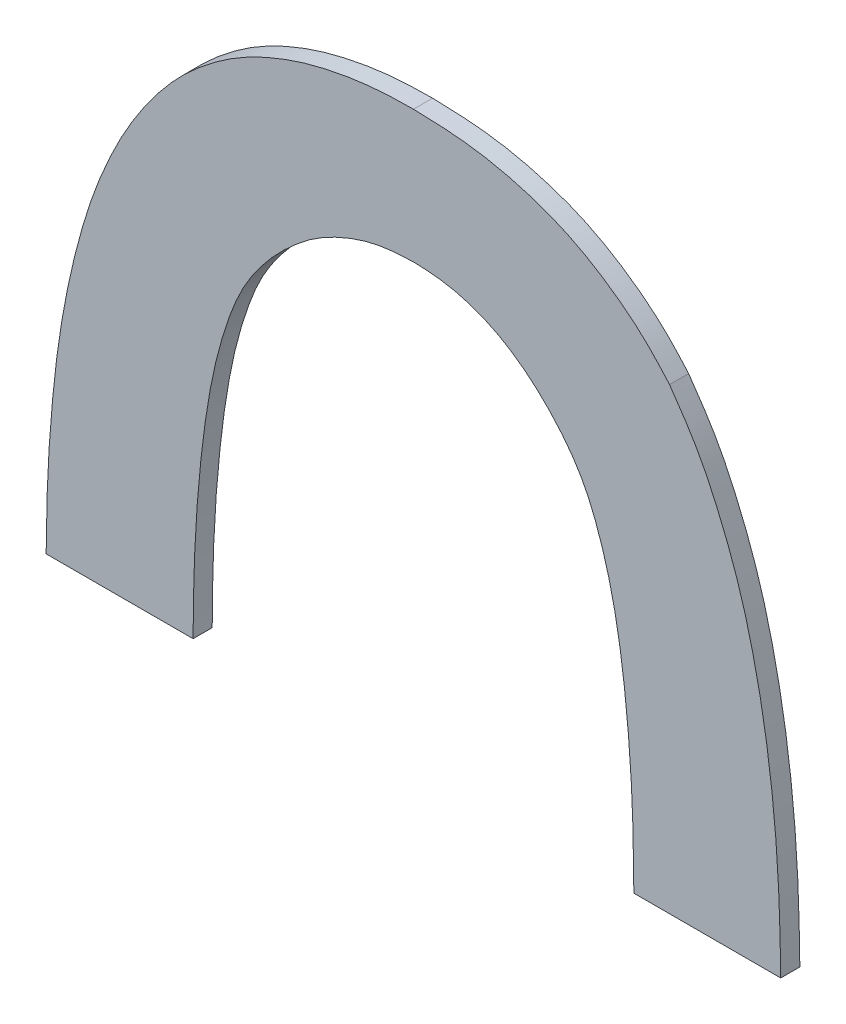
ISO-10303-21;
HEADER;
FILE_DESCRIPTION(('STEP AP214'),'2;1');
FILE_NAME('part.step','',(''),(''),'','','');
FILE_SCHEMA(('AUTOMOTIVE_DESIGN { 1 0 10303 214 1 1 1 1 }'));
ENDSEC;
DATA;
#1=APPLICATION_CONTEXT('core data for automotive mechanical design processes');
#2=APPLICATION_PROTOCOL_DEFINITION('international standard','automotive_design',2000,#1);
#3=PRODUCT_CONTEXT('',#1,'mechanical');
#4=PRODUCT('Part','Part','',(#3));
#5=PRODUCT_RELATED_PRODUCT_CATEGORY('part','',(#4));
#6=PRODUCT_DEFINITION_FORMATION('','',#4);
#7=PRODUCT_DEFINITION_CONTEXT('part definition',#1,'design');
#8=PRODUCT_DEFINITION('design','',#6,#7);
#9=PRODUCT_DEFINITION_SHAPE('','',#8);
#10=(LENGTH_UNIT() NAMED_UNIT(*) SI_UNIT(.MILLI.,.METRE.));
#11=(NAMED_UNIT(*) PLANE_ANGLE_UNIT() SI_UNIT($,.RADIAN.));
#12=(NAMED_UNIT(*) SI_UNIT($,.STERADIAN.) SOLID_ANGLE_UNIT());
#13=UNCERTAINTY_MEASURE_WITH_UNIT(LENGTH_MEASURE(1.E-05),#10,'distance_accuracy_value','');
#14=(GEOMETRIC_REPRESENTATION_CONTEXT(3) GLOBAL_UNCERTAINTY_ASSIGNED_CONTEXT((#13)) GLOBAL_UNIT_ASSIGNED_CONTEXT((#10,
#11,#12)) REPRESENTATION_CONTEXT('',''));
#15=CARTESIAN_POINT('',(0.,0.,0.));
#16=DIRECTION('',(0.,0.,1.));
#17=DIRECTION('',(1.,0.,0.));
#18=AXIS2_PLACEMENT_3D('',#15,#16,#17);
#19=CARTESIAN_POINT('',(9.0766529655937,6.58886102964351,0.5));
#20=DIRECTION('',(0.,0.,1.));
#21=DIRECTION('',(1.,0.,0.));
#22=AXIS2_PLACEMENT_3D('',#19,#20,#21);
#23=PLANE('',#22);
#24=CARTESIAN_POINT('',(6.70072115384615,12.4939903846154,0.5));
#25=CARTESIAN_POINT('',(6.93848015472102,12.1510195377811,0.5));
#26=CARTESIAN_POINT('',(7.42874939220466,11.4437989701565,0.5));
#27=CARTESIAN_POINT('',(8.0025670259053,10.2379222992365,0.5));
#28=CARTESIAN_POINT('',(8.51442251447216,8.91042139318135,0.5));
#29=CARTESIAN_POINT('',(8.91613522696191,7.4352508415858,0.5));
#30=CARTESIAN_POINT('',(9.23077641950199,5.82415133443517,0.5));
#31=CARTESIAN_POINT('',(9.45802591672864,4.07396155131179,0.5));
#32=CARTESIAN_POINT('',(9.58662675967264,2.18543763193961,0.5));
#33=CARTESIAN_POINT('',(9.60558226622776,0.879604630884591,0.5));
#34=CARTESIAN_POINT('',(9.61538461538461,0.204326923076923,0.5));
#35=B_SPLINE_CURVE_WITH_KNOTS('',3,(#24,#25,#26,#27,#28,#29,#30,#31,#32,#33,#34),.UNSPECIFIED.,
.F.,.F.,(4,1,1,1,1,1,1,1,4),(0.,0.0974206681772147,0.20088558803932,0.31117197017265,
0.429797945825373,0.557739926364587,0.694715269364159,0.842129910206055,1.),.UNSPECIFIED.);
#36=CARTESIAN_POINT('',(6.70072115384615,12.4939903846154,0.5));
#37=VERTEX_POINT('',#36);
#38=CARTESIAN_POINT('',(9.61103454417711,0.5,0.500000000000019));
#39=VERTEX_POINT('',#38);
#40=EDGE_CURVE('E173',#37,#39,#35,.T.);
#41=ORIENTED_EDGE('',*,*,#40,.T.);
#42=DIRECTION('',(-1.,0.,0.));
#43=VECTOR('',#42,1.);
#44=CARTESIAN_POINT('',(9.0766529655937,0.5,0.500000000000023));
#45=LINE('',#44,#43);
#46=CARTESIAN_POINT('',(5.76712364183989,0.5,0.5));
#47=VERTEX_POINT('',#46);
#48=EDGE_CURVE('E156',#39,#47,#45,.T.);
#49=ORIENTED_EDGE('',*,*,#48,.T.);
#50=CARTESIAN_POINT('',(5.76923076923077,0.192307692307691,0.5));
#51=CARTESIAN_POINT('',(5.76541184430827,0.769316809048792,0.5));
#52=CARTESIAN_POINT('',(5.75810157729552,1.8738398876058,0.5));
#53=CARTESIAN_POINT('',(5.68172703169984,3.45184166794594,0.500000000000001));
#54=CARTESIAN_POINT('',(5.55025139507145,4.87541467219255,0.5));
#55=CARTESIAN_POINT('',(5.37643201588861,6.14258787050518,0.5));
#56=CARTESIAN_POINT('',(5.1469200588336,7.25507536521718,0.5));
#57=CARTESIAN_POINT('',(4.85874065159084,8.21004219570989,0.5));
#58=CARTESIAN_POINT('',(4.53389391711504,9.01895012889618,0.5));
#59=CARTESIAN_POINT('',(4.13190223885222,9.67177337348959,0.5));
#60=CARTESIAN_POINT('',(3.69176575144396,10.2039195506745,0.5));
#61=CARTESIAN_POINT('',(3.23735490789571,10.6615824725694,0.5));
#62=CARTESIAN_POINT('',(2.75797899183766,11.0505854768679,0.5));
#63=CARTESIAN_POINT('',(2.25676587318836,11.3749346505379,0.5));
#64=CARTESIAN_POINT('',(1.72593886973115,11.6205105349227,0.5));
#65=CARTESIAN_POINT('',(1.17130248651205,11.7985044827674,0.5));
#66=CARTESIAN_POINT('',(0.592736039391641,11.900937266836,0.5));
#67=CARTESIAN_POINT('',(0.198705998676533,11.9156549304675,0.5));
#68=CARTESIAN_POINT('',(0.,11.9230769230769,0.5));
#69=B_SPLINE_CURVE_WITH_KNOTS('',3,(#50,#51,#52,#53,#54,#55,#56,#57,#58,#59,#60,#61,#62,#63,#64,
#65,#66,#67,#68),.UNSPECIFIED.,.F.,.F.,(4,1,1,1,1,1,1,1,1,1,1,1,1,1,1,1,4),(0.,0.11840550815377,
0.226654332816702,0.324092341928602,0.411704803005322,0.489025905006415,0.556909397343076,
0.616233344492707,0.667349281277075,0.713512393201348,0.757696504520978,0.799492511442291,
0.839976064743939,0.879885741816776,0.919148659385742,0.959227356493083,1.),.UNSPECIFIED.);
#70=CARTESIAN_POINT('',(0.,11.9230769230769,0.5));
#71=VERTEX_POINT('',#70);
#72=EDGE_CURVE('E154',#47,#71,#69,.T.);
#73=ORIENTED_EDGE('',*,*,#72,.T.);
#74=CARTESIAN_POINT('',(0.,11.9230769230769,0.5));
#75=CARTESIAN_POINT('',(-0.198657850303756,11.9154947114591,0.5));
#76=CARTESIAN_POINT('',(-0.592592413753884,11.9004593367227,0.5));
#77=CARTESIAN_POINT('',(-1.17247219559579,11.8002567974583,0.5));
#78=CARTESIAN_POINT('',(-1.72503848844903,11.6132064210181,0.5));
#79=CARTESIAN_POINT('',(-2.25474163815904,11.3680947593277,0.5));
#80=CARTESIAN_POINT('',(-2.76194741434262,11.0520075227223,0.5));
#81=CARTESIAN_POINT('',(-3.23475483188036,10.654405478869,0.5));
#82=CARTESIAN_POINT('',(-3.69425895729951,10.1981320129014,0.5));
#83=CARTESIAN_POINT('',(-4.12970262456193,9.65990773531915,0.5));
#84=CARTESIAN_POINT('',(-4.53434777984922,9.00731637963246,0.5));
#85=CARTESIAN_POINT('',(-4.85858084029624,8.19789469020418,0.5));
#86=CARTESIAN_POINT('',(-5.14702007387978,7.2431046011435,0.5));
#87=CARTESIAN_POINT('',(-5.37578143670155,6.1324674248149,0.5));
#88=CARTESIAN_POINT('',(-5.55083703658664,4.86748863015005,0.5));
#89=CARTESIAN_POINT('',(-5.68135384135656,3.44780370040746,0.5));
#90=CARTESIAN_POINT('',(-5.75828973102785,1.87185076152306,0.5));
#91=CARTESIAN_POINT('',(-5.76547193564942,0.769320839763397,0.5));
#92=CARTESIAN_POINT('',(-5.76923076923077,0.192307692307691,0.5));
#93=B_SPLINE_CURVE_WITH_KNOTS('',3,(#74,#75,#76,#77,#78,#79,#80,#81,#82,#83,#84,#85,#86,#87,#88,
#89,#90,#91,#92),.UNSPECIFIED.,.F.,.F.,(4,1,1,1,1,1,1,1,1,1,1,1,1,1,1,1,4),(0.,
0.0407861577516985,0.0808781390926986,0.120280881785303,0.160203787069477,0.200480932319815,
0.242550865687733,0.286749621995877,0.333247359898721,0.38438023925101,0.443723849544216,
0.511629842117632,0.588976572486409,0.676210959936693,0.773681265240179,0.881555245898873,1.),.UNSPECIFIED.);
#94=CARTESIAN_POINT('',(-5.76715468848255,0.5,0.5));
#95=VERTEX_POINT('',#94);
#96=EDGE_CURVE('E160',#71,#95,#93,.T.);
#97=ORIENTED_EDGE('',*,*,#96,.T.);
#98=CARTESIAN_POINT('',(-9.61258721768743,0.5,0.50000000000014));
#99=VERTEX_POINT('',#98);
#100=EDGE_CURVE('E80',#95,#99,#45,.T.);
#101=ORIENTED_EDGE('',*,*,#100,.T.);
#102=CARTESIAN_POINT('',(-9.61538461538462,0.204326923076923,0.5));
#103=CARTESIAN_POINT('',(-9.61145856322665,0.631043962467172,0.5));
#104=CARTESIAN_POINT('',(-9.60378824753444,1.46471969362867,0.5));
#105=CARTESIAN_POINT('',(-9.55767537045641,2.68344948992171,0.5));
#106=CARTESIAN_POINT('',(-9.47158634537625,3.84158428850893,0.5));
#107=CARTESIAN_POINT('',(-9.36072173748186,4.94055649567156,0.5));
#108=CARTESIAN_POINT('',(-9.21119805007303,5.98131553734991,0.5));
#109=CARTESIAN_POINT('',(-9.02554923703298,6.95963892277749,0.5));
#110=CARTESIAN_POINT('',(-8.80832522441868,7.87786000777091,0.5));
#111=CARTESIAN_POINT('',(-8.56406501827408,8.73966742410443,0.5));
#112=CARTESIAN_POINT('',(-8.28227468275697,9.54695919753204,0.5));
#113=CARTESIAN_POINT('',(-7.96297620458369,10.2987088643711,0.5));
#114=CARTESIAN_POINT('',(-7.61440146631394,11.0007377322815,0.5));
#115=CARTESIAN_POINT('',(-7.2305998067596,11.6494832820188,0.5));
#116=CARTESIAN_POINT('',(-6.81355391906376,12.2470885842866,0.5));
#117=CARTESIAN_POINT('',(-6.36999945723495,12.7975301031446,0.5));
#118=CARTESIAN_POINT('',(-5.88760410381791,13.293156056873,0.5));
#119=CARTESIAN_POINT('',(-5.36734414172277,13.7314513119745,0.5));
#120=CARTESIAN_POINT('',(-4.8196745058917,14.1263338106072,0.5));
#121=CARTESIAN_POINT('',(-4.23359523228683,14.4641304547667,0.5));
#122=CARTESIAN_POINT('',(-3.6104673407684,14.7459365123178,0.5));
#123=CARTESIAN_POINT('',(-2.95584714019533,14.9814671384459,0.5));
#124=CARTESIAN_POINT('',(-2.26538885150109,15.1604655008692,0.5));
#125=CARTESIAN_POINT('',(-1.54269028438993,15.2933670217436,0.5));
#126=CARTESIAN_POINT('',(-0.783036457639822,15.3727475557851,0.5));
#127=CARTESIAN_POINT('',(-0.264613338743074,15.380604861504,0.5));
#128=CARTESIAN_POINT('',(0.,15.3846153846154,0.5));
#129=B_SPLINE_CURVE_WITH_KNOTS('',3,(#102,#103,#104,#105,#106,#107,#108,#109,#110,#111,#112,
#113,#114,#115,#116,#117,#118,#119,#120,#121,#122,#123,#124,#125,#126,#127,#128),.UNSPECIFIED.,
.F.,.F.,(4,1,1,1,1,1,1,1,1,1,1,1,1,1,1,1,1,1,1,1,1,1,1,1,4),(0.,0.0628729369832541,
0.122834658266011,0.179653683665549,0.233956256795564,0.285547395045838,0.334518982056746,
0.380622703840521,0.424529503176761,0.466441676922807,0.506514585371817,0.544793011105453,
0.581845653009279,0.617462181423722,0.65208025855847,0.68589251728597,0.719186823394996,
0.752193384992977,0.785251372062182,0.818667121535925,0.85283561884342,0.887628146036853,
0.923636303848835,0.961022470139211,1.),.UNSPECIFIED.);
#130=CARTESIAN_POINT('',(0.,15.3846153846154,0.5));
#131=VERTEX_POINT('',#130);
#132=EDGE_CURVE('E97',#99,#131,#129,.T.);
#133=ORIENTED_EDGE('',*,*,#132,.T.);
#134=CARTESIAN_POINT('',(0.,15.3846153846154,0.5));
#135=CARTESIAN_POINT('',(0.346930981697959,15.3747191600178,0.5));
#136=CARTESIAN_POINT('',(1.02335090823051,15.3554242458463,0.5));
#137=CARTESIAN_POINT('',(2.01121233461011,15.2243271888231,0.5));
#138=CARTESIAN_POINT('',(2.93837297519816,14.9935902132229,0.5));
#139=CARTESIAN_POINT('',(3.81265289904248,14.6841393935695,0.5));
#140=CARTESIAN_POINT('',(4.62422496075007,14.2702311024062,0.5));
#141=CARTESIAN_POINT('',(5.37696409420881,13.7666308424472,0.5));
#142=CARTESIAN_POINT('',(6.08599604964775,13.1850554056395,0.5));
#143=CARTESIAN_POINT('',(6.49415794827905,12.7262057358726,0.5));
#144=CARTESIAN_POINT('',(6.70072115384615,12.4939903846154,0.5));
#145=B_SPLINE_CURVE_WITH_KNOTS('',3,(#134,#135,#136,#137,#138,#139,#140,#141,#142,#143,#144),
.UNSPECIFIED.,.F.,.F.,(4,1,1,1,1,1,1,1,4),(0.,0.137903229993394,0.268873342600294,
0.395178127346113,0.517089238130888,0.636743026513548,0.756221816463797,0.87662835946368,1.),.UNSPECIFIED.);
#146=EDGE_CURVE('E105',#131,#37,#145,.T.);
#147=ORIENTED_EDGE('',*,*,#146,.T.);
#148=EDGE_LOOP('',(#41,#49,#73,#97,#101,#133,#147));
#149=FACE_BOUND('',#148,.T.);
#150=ADVANCED_FACE('F39',(#149),#23,.F.);
#151=CARTESIAN_POINT('',(9.0766529655937,6.58886102964351,1.));
#152=DIRECTION('',(0.,0.,1.));
#153=DIRECTION('',(1.,0.,0.));
#154=AXIS2_PLACEMENT_3D('',#151,#152,#153);
#155=PLANE('',#154);
#156=CARTESIAN_POINT('',(-9.61538461538462,0.204326923076923,1.));
#157=CARTESIAN_POINT('',(-9.61145856322665,0.631043962467172,1.));
#158=CARTESIAN_POINT('',(-9.60378824753444,1.46471969362867,1.));
#159=CARTESIAN_POINT('',(-9.55767537045641,2.68344948992171,1.));
#160=CARTESIAN_POINT('',(-9.47158634537625,3.84158428850893,1.));
#161=CARTESIAN_POINT('',(-9.36072173748186,4.94055649567156,1.));
#162=CARTESIAN_POINT('',(-9.21119805007303,5.98131553734991,1.));
#163=CARTESIAN_POINT('',(-9.02554923703298,6.95963892277749,1.));
#164=CARTESIAN_POINT('',(-8.80832522441868,7.87786000777091,1.));
#165=CARTESIAN_POINT('',(-8.56406501827408,8.73966742410443,1.));
#166=CARTESIAN_POINT('',(-8.28227468275697,9.54695919753204,1.));
#167=CARTESIAN_POINT('',(-7.96297620458369,10.2987088643711,1.));
#168=CARTESIAN_POINT('',(-7.61440146631394,11.0007377322815,1.));
#169=CARTESIAN_POINT('',(-7.2305998067596,11.6494832820188,1.));
#170=CARTESIAN_POINT('',(-6.81355391906376,12.2470885842866,1.));
#171=CARTESIAN_POINT('',(-6.36999945723495,12.7975301031446,1.));
#172=CARTESIAN_POINT('',(-5.88760410381791,13.293156056873,1.));
#173=CARTESIAN_POINT('',(-5.36734414172277,13.7314513119745,1.));
#174=CARTESIAN_POINT('',(-4.8196745058917,14.1263338106072,1.));
#175=CARTESIAN_POINT('',(-4.23359523228683,14.4641304547667,1.));
#176=CARTESIAN_POINT('',(-3.6104673407684,14.7459365123178,1.));
#177=CARTESIAN_POINT('',(-2.95584714019533,14.9814671384459,1.));
#178=CARTESIAN_POINT('',(-2.26538885150109,15.1604655008692,1.));
#179=CARTESIAN_POINT('',(-1.54269028438993,15.2933670217436,1.));
#180=CARTESIAN_POINT('',(-0.783036457639822,15.3727475557851,1.));
#181=CARTESIAN_POINT('',(-0.264613338743074,15.380604861504,1.));
#182=CARTESIAN_POINT('',(0.,15.3846153846154,1.));
#183=B_SPLINE_CURVE_WITH_KNOTS('',3,(#156,#157,#158,#159,#160,#161,#162,#163,#164,#165,#166,
#167,#168,#169,#170,#171,#172,#173,#174,#175,#176,#177,#178,#179,#180,#181,#182),.UNSPECIFIED.,
.F.,.F.,(4,1,1,1,1,1,1,1,1,1,1,1,1,1,1,1,1,1,1,1,1,1,1,1,4),(0.,0.0628729369832541,
0.122834658266011,0.179653683665549,0.233956256795564,0.285547395045838,0.334518982056746,
0.380622703840521,0.424529503176761,0.466441676922807,0.506514585371817,0.544793011105453,
0.581845653009279,0.617462181423722,0.65208025855847,0.68589251728597,0.719186823394996,
0.752193384992977,0.785251372062182,0.818667121535925,0.85283561884342,0.887628146036853,
0.923636303848835,0.961022470139211,1.),.UNSPECIFIED.);
#184=CARTESIAN_POINT('',(-9.61258721768743,0.5,1.));
#185=VERTEX_POINT('',#184);
#186=CARTESIAN_POINT('',(0.,15.3846153846154,1.));
#187=VERTEX_POINT('',#186);
#188=EDGE_CURVE('E112',#185,#187,#183,.T.);
#189=ORIENTED_EDGE('',*,*,#188,.F.);
#190=DIRECTION('',(1.,0.,0.));
#191=VECTOR('',#190,1.);
#192=CARTESIAN_POINT('',(-17.,0.5,1.));
#193=LINE('',#192,#191);
#194=CARTESIAN_POINT('',(-5.76715468848255,0.5,1.));
#195=VERTEX_POINT('',#194);
#196=EDGE_CURVE('E123',#185,#195,#193,.T.);
#197=ORIENTED_EDGE('',*,*,#196,.T.);
#198=CARTESIAN_POINT('',(0.,11.9230769230769,1.));
#199=CARTESIAN_POINT('',(-0.198657850303756,11.9154947114591,1.));
#200=CARTESIAN_POINT('',(-0.592592413753884,11.9004593367227,1.));
#201=CARTESIAN_POINT('',(-1.17247219559579,11.8002567974583,1.));
#202=CARTESIAN_POINT('',(-1.72503848844903,11.6132064210181,1.));
#203=CARTESIAN_POINT('',(-2.25474163815904,11.3680947593277,1.));
#204=CARTESIAN_POINT('',(-2.76194741434262,11.0520075227223,1.));
#205=CARTESIAN_POINT('',(-3.23475483188036,10.654405478869,1.));
#206=CARTESIAN_POINT('',(-3.69425895729951,10.1981320129014,1.));
#207=CARTESIAN_POINT('',(-4.12970262456193,9.65990773531915,1.));
#208=CARTESIAN_POINT('',(-4.53434777984922,9.00731637963246,1.));
#209=CARTESIAN_POINT('',(-4.85858084029624,8.19789469020418,1.));
#210=CARTESIAN_POINT('',(-5.14702007387978,7.2431046011435,1.));
#211=CARTESIAN_POINT('',(-5.37578143670155,6.1324674248149,1.));
#212=CARTESIAN_POINT('',(-5.55083703658664,4.86748863015005,1.));
#213=CARTESIAN_POINT('',(-5.68135384135656,3.44780370040746,1.));
#214=CARTESIAN_POINT('',(-5.75828973102785,1.87185076152306,1.));
#215=CARTESIAN_POINT('',(-5.76547193564942,0.769320839763397,1.));
#216=CARTESIAN_POINT('',(-5.76923076923077,0.192307692307691,1.));
#217=B_SPLINE_CURVE_WITH_KNOTS('',3,(#198,#199,#200,#201,#202,#203,#204,#205,#206,#207,#208,
#209,#210,#211,#212,#213,#214,#215,#216),.UNSPECIFIED.,.F.,.F.,(4,1,1,1,1,1,1,1,1,1,1,1,1,1,1,1,
4),(0.,0.0407861577516985,0.0808781390926986,0.120280881785303,0.160203787069477,
0.200480932319815,0.242550865687733,0.286749621995877,0.333247359898721,0.38438023925101,
0.443723849544216,0.511629842117632,0.588976572486409,0.676210959936693,0.773681265240179,
0.881555245898873,1.),.UNSPECIFIED.);
#218=CARTESIAN_POINT('',(0.,11.9230769230769,1.));
#219=VERTEX_POINT('',#218);
#220=EDGE_CURVE('E114',#219,#195,#217,.T.);
#221=ORIENTED_EDGE('',*,*,#220,.F.);
#222=CARTESIAN_POINT('',(5.76923076923077,0.192307692307691,1.));
#223=CARTESIAN_POINT('',(5.76541184430827,0.769316809048792,1.));
#224=CARTESIAN_POINT('',(5.75810157729552,1.8738398876058,1.));
#225=CARTESIAN_POINT('',(5.68172703169984,3.45184166794594,1.));
#226=CARTESIAN_POINT('',(5.55025139507145,4.87541467219255,1.));
#227=CARTESIAN_POINT('',(5.37643201588861,6.14258787050518,1.));
#228=CARTESIAN_POINT('',(5.1469200588336,7.25507536521718,1.));
#229=CARTESIAN_POINT('',(4.85874065159084,8.21004219570989,1.));
#230=CARTESIAN_POINT('',(4.53389391711504,9.01895012889618,1.));
#231=CARTESIAN_POINT('',(4.13190223885222,9.67177337348959,1.));
#232=CARTESIAN_POINT('',(3.69176575144396,10.2039195506745,1.));
#233=CARTESIAN_POINT('',(3.23735490789571,10.6615824725694,1.));
#234=CARTESIAN_POINT('',(2.75797899183766,11.0505854768679,1.));
#235=CARTESIAN_POINT('',(2.25676587318836,11.3749346505379,1.));
#236=CARTESIAN_POINT('',(1.72593886973115,11.6205105349227,1.));
#237=CARTESIAN_POINT('',(1.17130248651205,11.7985044827674,1.));
#238=CARTESIAN_POINT('',(0.592736039391641,11.900937266836,1.));
#239=CARTESIAN_POINT('',(0.198705998676533,11.9156549304675,1.));
#240=CARTESIAN_POINT('',(0.,11.9230769230769,1.));
#241=B_SPLINE_CURVE_WITH_KNOTS('',3,(#222,#223,#224,#225,#226,#227,#228,#229,#230,#231,#232,
#233,#234,#235,#236,#237,#238,#239,#240),.UNSPECIFIED.,.F.,.F.,(4,1,1,1,1,1,1,1,1,1,1,1,1,1,1,1,
4),(0.,0.11840550815377,0.226654332816702,0.324092341928602,0.411704803005322,0.489025905006415,
0.556909397343076,0.616233344492707,0.667349281277075,0.713512393201348,0.757696504520978,
0.799492511442291,0.839976064743939,0.879885741816776,0.919148659385742,0.959227356493083,1.),.UNSPECIFIED.);
#242=CARTESIAN_POINT('',(5.76712364183989,0.5,1.));
#243=VERTEX_POINT('',#242);
#244=EDGE_CURVE('E11',#243,#219,#241,.T.);
#245=ORIENTED_EDGE('',*,*,#244,.F.);
#246=CARTESIAN_POINT('',(9.61103454417711,0.5,1.));
#247=VERTEX_POINT('',#246);
#248=EDGE_CURVE('E43',#243,#247,#193,.T.);
#249=ORIENTED_EDGE('',*,*,#248,.T.);
#250=CARTESIAN_POINT('',(6.70072115384615,12.4939903846154,1.));
#251=CARTESIAN_POINT('',(6.93848015472102,12.1510195377811,1.));
#252=CARTESIAN_POINT('',(7.42874939220466,11.4437989701565,1.));
#253=CARTESIAN_POINT('',(8.0025670259053,10.2379222992365,1.));
#254=CARTESIAN_POINT('',(8.51442251447216,8.91042139318135,1.));
#255=CARTESIAN_POINT('',(8.91613522696191,7.4352508415858,1.));
#256=CARTESIAN_POINT('',(9.23077641950199,5.82415133443517,1.));
#257=CARTESIAN_POINT('',(9.45802591672864,4.07396155131179,1.));
#258=CARTESIAN_POINT('',(9.58662675967264,2.18543763193961,1.));
#259=CARTESIAN_POINT('',(9.60558226622776,0.879604630884591,1.));
#260=CARTESIAN_POINT('',(9.61538461538461,0.204326923076923,1.));
#261=B_SPLINE_CURVE_WITH_KNOTS('',3,(#250,#251,#252,#253,#254,#255,#256,#257,#258,#259,#260),
.UNSPECIFIED.,.F.,.F.,(4,1,1,1,1,1,1,1,4),(0.,0.0974206681772147,0.20088558803932,
0.31117197017265,0.429797945825373,0.557739926364587,0.694715269364159,0.842129910206055,1.),.UNSPECIFIED.);
#262=CARTESIAN_POINT('',(6.70072115384615,12.4939903846154,1.));
#263=VERTEX_POINT('',#262);
#264=EDGE_CURVE('E130',#263,#247,#261,.T.);
#265=ORIENTED_EDGE('',*,*,#264,.F.);
#266=CARTESIAN_POINT('',(0.,15.3846153846154,1.));
#267=CARTESIAN_POINT('',(0.346930981697959,15.3747191600178,1.));
#268=CARTESIAN_POINT('',(1.02335090823051,15.3554242458463,1.));
#269=CARTESIAN_POINT('',(2.01121233461011,15.2243271888231,1.));
#270=CARTESIAN_POINT('',(2.93837297519816,14.9935902132229,1.));
#271=CARTESIAN_POINT('',(3.81265289904248,14.6841393935695,1.));
#272=CARTESIAN_POINT('',(4.62422496075007,14.2702311024062,1.));
#273=CARTESIAN_POINT('',(5.37696409420881,13.7666308424472,1.));
#274=CARTESIAN_POINT('',(6.08599604964775,13.1850554056395,1.));
#275=CARTESIAN_POINT('',(6.49415794827905,12.7262057358726,1.));
#276=CARTESIAN_POINT('',(6.70072115384615,12.4939903846154,1.));
#277=B_SPLINE_CURVE_WITH_KNOTS('',3,(#266,#267,#268,#269,#270,#271,#272,#273,#274,#275,#276),
.UNSPECIFIED.,.F.,.F.,(4,1,1,1,1,1,1,1,4),(0.,0.137903229993394,0.268873342600294,
0.395178127346113,0.517089238130888,0.636743026513548,0.756221816463797,0.87662835946368,1.),.UNSPECIFIED.);
#278=EDGE_CURVE('E113',#187,#263,#277,.T.);
#279=ORIENTED_EDGE('',*,*,#278,.F.);
#280=EDGE_LOOP('',(#189,#197,#221,#245,#249,#265,#279));
#281=FACE_BOUND('',#280,.T.);
#282=ADVANCED_FACE('F41',(#281),#155,.T.);
#283=DIRECTION('',(0.,0.,1.));
#284=VECTOR('',#283,1.);
#285=SURFACE_OF_LINEAR_EXTRUSION('',#35,#284);
#286=ORIENTED_EDGE('',*,*,#264,.T.);
#287=DIRECTION('',(0.,0.,1.));
#288=VECTOR('',#287,1.);
#289=CARTESIAN_POINT('',(9.61103454417711,0.499999999999999,0.5));
#290=LINE('',#289,#288);
#291=EDGE_CURVE('E166',#247,#39,#290,.F.);
#292=ORIENTED_EDGE('',*,*,#291,.T.);
#293=ORIENTED_EDGE('',*,*,#40,.F.);
#294=DIRECTION('',(0.,0.,1.));
#295=VECTOR('',#294,1.);
#296=CARTESIAN_POINT('',(6.70072115384615,12.4939903846154,0.5));
#297=LINE('',#296,#295);
#298=EDGE_CURVE('E116',#37,#263,#297,.T.);
#299=ORIENTED_EDGE('',*,*,#298,.T.);
#300=EDGE_LOOP('',(#286,#292,#293,#299));
#301=FACE_BOUND('',#300,.T.);
#302=ADVANCED_FACE('F212',(#301),#285,.F.);
#303=DIRECTION('',(0.,0.,1.));
#304=VECTOR('',#303,1.);
#305=SURFACE_OF_LINEAR_EXTRUSION('',#129,#304);
#306=ORIENTED_EDGE('',*,*,#132,.F.);
#307=DIRECTION('',(0.,0.,1.));
#308=VECTOR('',#307,1.);
#309=CARTESIAN_POINT('',(-9.61258721768742,0.5,0.5));
#310=LINE('',#309,#308);
#311=EDGE_CURVE('E60',#99,#185,#310,.T.);
#312=ORIENTED_EDGE('',*,*,#311,.T.);
#313=ORIENTED_EDGE('',*,*,#188,.T.);
#314=DIRECTION('',(0.,0.,1.));
#315=VECTOR('',#314,1.);
#316=CARTESIAN_POINT('',(0.,15.3846153846154,0.5));
#317=LINE('',#316,#315);
#318=EDGE_CURVE('E110',#131,#187,#317,.T.);
#319=ORIENTED_EDGE('',*,*,#318,.F.);
#320=EDGE_LOOP('',(#306,#312,#313,#319));
#321=FACE_BOUND('',#320,.T.);
#322=ADVANCED_FACE('F106',(#321),#305,.F.);
#323=DIRECTION('',(0.,0.,1.));
#324=VECTOR('',#323,1.);
#325=SURFACE_OF_LINEAR_EXTRUSION('',#145,#324);
#326=ORIENTED_EDGE('',*,*,#278,.T.);
#327=ORIENTED_EDGE('',*,*,#298,.F.);
#328=ORIENTED_EDGE('',*,*,#146,.F.);
#329=ORIENTED_EDGE('',*,*,#318,.T.);
#330=EDGE_LOOP('',(#326,#327,#328,#329));
#331=FACE_BOUND('',#330,.T.);
#332=ADVANCED_FACE('F119',(#331),#325,.F.);
#333=DIRECTION('',(0.,0.,1.));
#334=VECTOR('',#333,1.);
#335=SURFACE_OF_LINEAR_EXTRUSION('',#93,#334);
#336=ORIENTED_EDGE('',*,*,#220,.T.);
#337=DIRECTION('',(0.,0.,1.));
#338=VECTOR('',#337,1.);
#339=CARTESIAN_POINT('',(-5.76715468848255,0.5,0.5));
#340=LINE('',#339,#338);
#341=EDGE_CURVE('E78',#195,#95,#340,.F.);
#342=ORIENTED_EDGE('',*,*,#341,.T.);
#343=ORIENTED_EDGE('',*,*,#96,.F.);
#344=DIRECTION('',(0.,0.,1.));
#345=VECTOR('',#344,1.);
#346=CARTESIAN_POINT('',(0.,11.9230769230769,0.5));
#347=LINE('',#346,#345);
#348=EDGE_CURVE('E167',#71,#219,#347,.T.);
#349=ORIENTED_EDGE('',*,*,#348,.T.);
#350=EDGE_LOOP('',(#336,#342,#343,#349));
#351=FACE_BOUND('',#350,.T.);
#352=ADVANCED_FACE('F145',(#351),#335,.F.);
#353=DIRECTION('',(0.,0.,1.));
#354=VECTOR('',#353,1.);
#355=SURFACE_OF_LINEAR_EXTRUSION('',#69,#354);
#356=ORIENTED_EDGE('',*,*,#72,.F.);
#357=DIRECTION('',(0.,0.,1.));
#358=VECTOR('',#357,1.);
#359=CARTESIAN_POINT('',(5.76712364183989,0.5,0.5));
#360=LINE('',#359,#358);
#361=EDGE_CURVE('E47',#47,#243,#360,.T.);
#362=ORIENTED_EDGE('',*,*,#361,.T.);
#363=ORIENTED_EDGE('',*,*,#244,.T.);
#364=ORIENTED_EDGE('',*,*,#348,.F.);
#365=EDGE_LOOP('',(#356,#362,#363,#364));
#366=FACE_BOUND('',#365,.T.);
#367=ADVANCED_FACE('F143',(#366),#355,.F.);
#368=CARTESIAN_POINT('',(-17.,0.5,1.));
#369=DIRECTION('',(0.,1.,0.));
#370=DIRECTION('',(0.,0.,1.));
#371=AXIS2_PLACEMENT_3D('',#368,#369,#370);
#372=PLANE('',#371);
#373=ORIENTED_EDGE('',*,*,#248,.F.);
#374=ORIENTED_EDGE('',*,*,#361,.F.);
#375=ORIENTED_EDGE('',*,*,#48,.F.);
#376=ORIENTED_EDGE('',*,*,#291,.F.);
#377=EDGE_LOOP('',(#373,#374,#375,#376));
#378=FACE_BOUND('',#377,.T.);
#379=ADVANCED_FACE('F149',(#378),#372,.F.);
#380=ORIENTED_EDGE('',*,*,#100,.F.);
#381=ORIENTED_EDGE('',*,*,#341,.F.);
#382=ORIENTED_EDGE('',*,*,#196,.F.);
#383=ORIENTED_EDGE('',*,*,#311,.F.);
#384=EDGE_LOOP('',(#380,#381,#382,#383));
#385=FACE_BOUND('',#384,.T.);
#386=ADVANCED_FACE('F196',(#385),#372,.F.);
#387=CLOSED_SHELL('',(#150,#282,#302,#322,#332,#352,#367,#379,#386));
#388=MANIFOLD_SOLID_BREP('B2',#387);
#389=ADVANCED_BREP_SHAPE_REPRESENTATION('',(#18,#388),#14);
#390=SHAPE_DEFINITION_REPRESENTATION(#9,#389);
ENDSEC;
END-ISO-10303-21;
